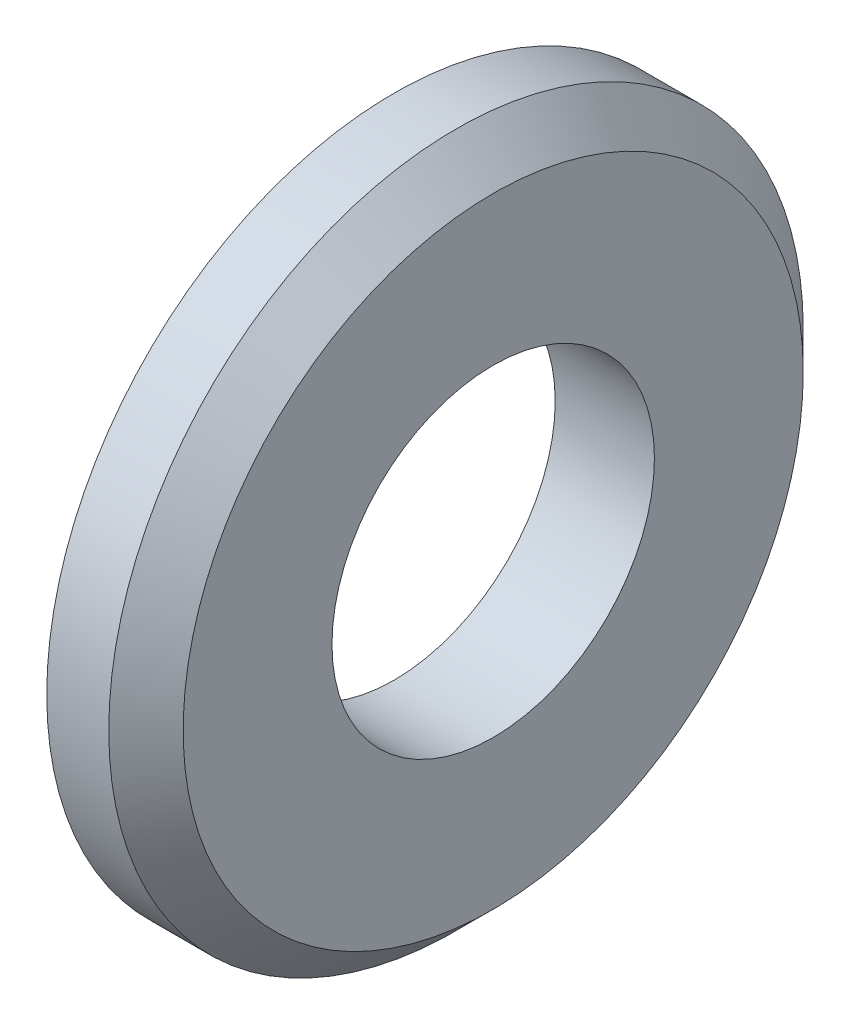
ISO-10303-21;
HEADER;
FILE_DESCRIPTION(('STEP AP214'),'2;1');
FILE_NAME('part.step','',(''),(''),'','','');
FILE_SCHEMA(('AUTOMOTIVE_DESIGN { 1 0 10303 214 1 1 1 1 }'));
ENDSEC;
DATA;
#1=APPLICATION_CONTEXT('core data for automotive mechanical design processes');
#2=APPLICATION_PROTOCOL_DEFINITION('international standard','automotive_design',2000,#1);
#3=PRODUCT_CONTEXT('',#1,'mechanical');
#4=PRODUCT('Part','Part','',(#3));
#5=PRODUCT_RELATED_PRODUCT_CATEGORY('part','',(#4));
#6=PRODUCT_DEFINITION_FORMATION('','',#4);
#7=PRODUCT_DEFINITION_CONTEXT('part definition',#1,'design');
#8=PRODUCT_DEFINITION('design','',#6,#7);
#9=PRODUCT_DEFINITION_SHAPE('','',#8);
#10=(LENGTH_UNIT() NAMED_UNIT(*) SI_UNIT(.MILLI.,.METRE.));
#11=(NAMED_UNIT(*) PLANE_ANGLE_UNIT() SI_UNIT($,.RADIAN.));
#12=(NAMED_UNIT(*) SI_UNIT($,.STERADIAN.) SOLID_ANGLE_UNIT());
#13=UNCERTAINTY_MEASURE_WITH_UNIT(LENGTH_MEASURE(1.E-05),#10,'distance_accuracy_value','');
#14=(GEOMETRIC_REPRESENTATION_CONTEXT(3) GLOBAL_UNCERTAINTY_ASSIGNED_CONTEXT((#13)) GLOBAL_UNIT_ASSIGNED_CONTEXT((#10,
#11,#12)) REPRESENTATION_CONTEXT('',''));
#15=CARTESIAN_POINT('',(0.,0.,0.));
#16=DIRECTION('',(0.,0.,1.));
#17=DIRECTION('',(1.,0.,0.));
#18=AXIS2_PLACEMENT_3D('',#15,#16,#17);
#19=CARTESIAN_POINT('',(0.,0.,0.));
#20=DIRECTION('',(1.,0.,0.));
#21=DIRECTION('',(0.,0.,-1.));
#22=AXIS2_PLACEMENT_3D('',#19,#20,#21);
#23=CYLINDRICAL_SURFACE('',#22,6.5);
#24=CARTESIAN_POINT('',(0.,0.,0.));
#25=DIRECTION('',(1.,0.,0.));
#26=DIRECTION('',(0.,0.,-1.));
#27=AXIS2_PLACEMENT_3D('',#24,#25,#26);
#28=CIRCLE('',#27,6.5);
#29=CARTESIAN_POINT('',(0.,0.,-6.5));
#30=VERTEX_POINT('',#29);
#31=EDGE_CURVE('E45',#30,#30,#28,.T.);
#32=ORIENTED_EDGE('',*,*,#31,.T.);
#33=EDGE_LOOP('',(#32));
#34=FACE_BOUND('',#33,.T.);
#35=CARTESIAN_POINT('',(-4.,0.,0.));
#36=DIRECTION('',(1.,0.,0.));
#37=DIRECTION('',(0.,0.,-1.));
#38=AXIS2_PLACEMENT_3D('',#35,#36,#37);
#39=CIRCLE('',#38,6.5);
#40=CARTESIAN_POINT('',(-4.,0.,-6.5));
#41=VERTEX_POINT('',#40);
#42=EDGE_CURVE('E54',#41,#41,#39,.T.);
#43=ORIENTED_EDGE('',*,*,#42,.F.);
#44=EDGE_LOOP('',(#43));
#45=FACE_BOUND('',#44,.T.);
#46=ADVANCED_FACE('F34',(#34,#45),#23,.F.);
#47=CARTESIAN_POINT('',(0.,6.5,0.));
#48=DIRECTION('',(1.,0.,0.));
#49=DIRECTION('',(0.,0.,-1.));
#50=AXIS2_PLACEMENT_3D('',#47,#48,#49);
#51=PLANE('',#50);
#52=CARTESIAN_POINT('',(0.,0.,0.));
#53=DIRECTION('',(1.,0.,0.));
#54=DIRECTION('',(0.,0.,-1.));
#55=AXIS2_PLACEMENT_3D('',#52,#53,#54);
#56=CIRCLE('',#55,12.5);
#57=CARTESIAN_POINT('',(0.,0.,-12.5));
#58=VERTEX_POINT('',#57);
#59=EDGE_CURVE('E41',#58,#58,#56,.T.);
#60=ORIENTED_EDGE('',*,*,#59,.T.);
#61=EDGE_LOOP('',(#60));
#62=FACE_BOUND('',#61,.T.);
#63=ORIENTED_EDGE('',*,*,#31,.F.);
#64=EDGE_LOOP('',(#63));
#65=FACE_BOUND('',#64,.T.);
#66=ADVANCED_FACE('F62',(#62,#65),#51,.T.);
#67=CARTESIAN_POINT('',(0.,0.,0.));
#68=DIRECTION('',(1.,0.,0.));
#69=DIRECTION('',(0.,0.,-1.));
#70=AXIS2_PLACEMENT_3D('',#67,#68,#69);
#71=CYLINDRICAL_SURFACE('',#70,14.);
#72=CARTESIAN_POINT('',(-1.50000000000001,0.,0.));
#73=DIRECTION('',(1.,0.,0.));
#74=DIRECTION('',(0.,0.,-1.));
#75=AXIS2_PLACEMENT_3D('',#72,#73,#74);
#76=CIRCLE('',#75,14.);
#77=CARTESIAN_POINT('',(-1.50000000000001,0.,-14.));
#78=VERTEX_POINT('',#77);
#79=EDGE_CURVE('E10',#78,#78,#76,.F.);
#80=ORIENTED_EDGE('',*,*,#79,.T.);
#81=EDGE_LOOP('',(#80));
#82=FACE_BOUND('',#81,.T.);
#83=CARTESIAN_POINT('',(-4.,0.,0.));
#84=DIRECTION('',(1.,0.,0.));
#85=DIRECTION('',(0.,0.,-1.));
#86=AXIS2_PLACEMENT_3D('',#83,#84,#85);
#87=CIRCLE('',#86,14.);
#88=CARTESIAN_POINT('',(-4.,0.,-14.));
#89=VERTEX_POINT('',#88);
#90=EDGE_CURVE('E49',#89,#89,#87,.T.);
#91=ORIENTED_EDGE('',*,*,#90,.T.);
#92=EDGE_LOOP('',(#91));
#93=FACE_BOUND('',#92,.T.);
#94=ADVANCED_FACE('F67',(#82,#93),#71,.T.);
#95=CARTESIAN_POINT('',(-4.,14.,0.));
#96=DIRECTION('',(-1.,0.,0.));
#97=DIRECTION('',(0.,0.,1.));
#98=AXIS2_PLACEMENT_3D('',#95,#96,#97);
#99=PLANE('',#98);
#100=ORIENTED_EDGE('',*,*,#42,.T.);
#101=EDGE_LOOP('',(#100));
#102=FACE_BOUND('',#101,.T.);
#103=ORIENTED_EDGE('',*,*,#90,.F.);
#104=EDGE_LOOP('',(#103));
#105=FACE_BOUND('',#104,.T.);
#106=ADVANCED_FACE('F58',(#102,#105),#99,.T.);
#107=CARTESIAN_POINT('',(0.,0.,0.));
#108=DIRECTION('',(-1.,0.,0.));
#109=DIRECTION('',(0.,0.,1.));
#110=AXIS2_PLACEMENT_3D('',#107,#108,#109);
#111=CONICAL_SURFACE('',#110,12.5,0.785398163397446);
#112=ORIENTED_EDGE('',*,*,#79,.F.);
#113=EDGE_LOOP('',(#112));
#114=FACE_BOUND('',#113,.T.);
#115=ORIENTED_EDGE('',*,*,#59,.F.);
#116=EDGE_LOOP('',(#115));
#117=FACE_BOUND('',#116,.T.);
#118=ADVANCED_FACE('F36',(#114,#117),#111,.T.);
#119=CLOSED_SHELL('',(#46,#66,#94,#106,#118));
#120=MANIFOLD_SOLID_BREP('B2',#119);
#121=ADVANCED_BREP_SHAPE_REPRESENTATION('',(#18,#120),#14);
#122=SHAPE_DEFINITION_REPRESENTATION(#9,#121);
ENDSEC;
END-ISO-10303-21;
